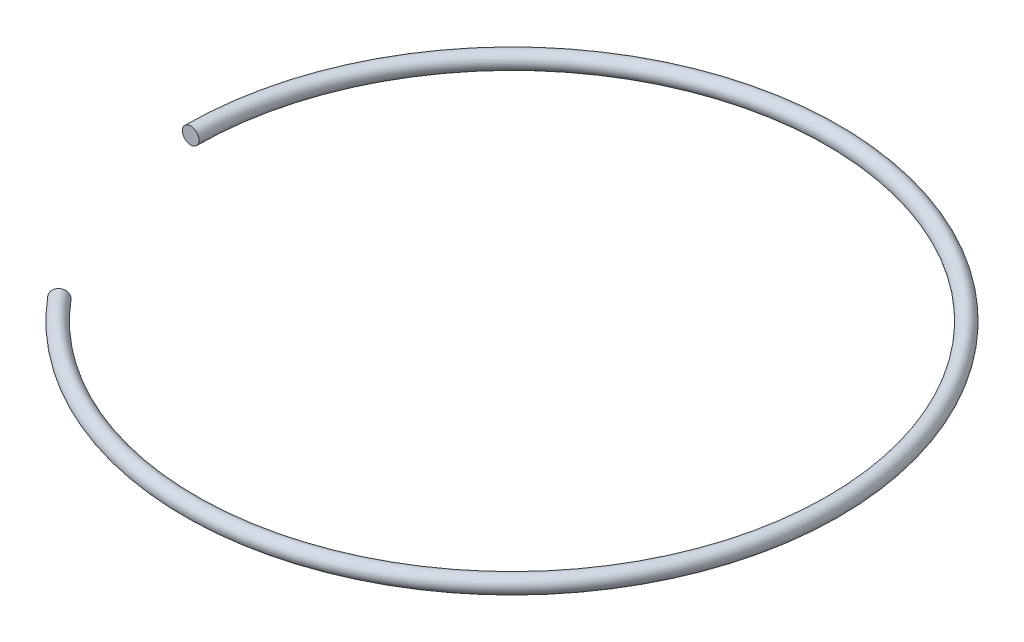
ISO-10303-21;
HEADER;
FILE_DESCRIPTION(('STEP AP214'),'2;1');
FILE_NAME('part.step','',(''),(''),'','','');
FILE_SCHEMA(('AUTOMOTIVE_DESIGN { 1 0 10303 214 1 1 1 1 }'));
ENDSEC;
DATA;
#1=APPLICATION_CONTEXT('core data for automotive mechanical design processes');
#2=APPLICATION_PROTOCOL_DEFINITION('international standard','automotive_design',2000,#1);
#3=PRODUCT_CONTEXT('',#1,'mechanical');
#4=PRODUCT('Part','Part','',(#3));
#5=PRODUCT_RELATED_PRODUCT_CATEGORY('part','',(#4));
#6=PRODUCT_DEFINITION_FORMATION('','',#4);
#7=PRODUCT_DEFINITION_CONTEXT('part definition',#1,'design');
#8=PRODUCT_DEFINITION('design','',#6,#7);
#9=PRODUCT_DEFINITION_SHAPE('','',#8);
#10=(LENGTH_UNIT() NAMED_UNIT(*) SI_UNIT(.MILLI.,.METRE.));
#11=(NAMED_UNIT(*) PLANE_ANGLE_UNIT() SI_UNIT($,.RADIAN.));
#12=(NAMED_UNIT(*) SI_UNIT($,.STERADIAN.) SOLID_ANGLE_UNIT());
#13=UNCERTAINTY_MEASURE_WITH_UNIT(LENGTH_MEASURE(1.E-05),#10,'distance_accuracy_value','');
#14=(GEOMETRIC_REPRESENTATION_CONTEXT(3) GLOBAL_UNCERTAINTY_ASSIGNED_CONTEXT((#13)) GLOBAL_UNIT_ASSIGNED_CONTEXT((#10,
#11,#12)) REPRESENTATION_CONTEXT('',''));
#15=CARTESIAN_POINT('',(0.,0.,0.));
#16=DIRECTION('',(0.,0.,1.));
#17=DIRECTION('',(1.,0.,0.));
#18=AXIS2_PLACEMENT_3D('',#15,#16,#17);
#19=CARTESIAN_POINT('',(0.,5.,0.));
#20=DIRECTION('',(0.,0.,1.));
#21=DIRECTION('',(1.,0.,0.));
#22=AXIS2_PLACEMENT_3D('',#19,#20,#21);
#23=PLANE('',#22);
#24=CARTESIAN_POINT('',(-5.65,0.440000000000001,0.));
#25=CARTESIAN_POINT('',(-5.65001062983499,0.42319249164499,0.));
#26=CARTESIAN_POINT('',(-5.65287538462174,0.406281558710686,0.));
#27=CARTESIAN_POINT('',(-5.66403597751348,0.374416764003044,0.));
#28=CARTESIAN_POINT('',(-5.67233181561848,0.359462902229706,0.));
#29=CARTESIAN_POINT('',(-5.69340700512756,0.333129254032241,0.));
#30=CARTESIAN_POINT('',(-5.70618635653177,0.321749467608205,0.));
#31=CARTESIAN_POINT('',(-5.73479109373737,0.303865334950795,0.));
#32=CARTESIAN_POINT('',(-5.75061647953878,0.297360988717422,0.));
#33=CARTESIAN_POINT('',(-5.78352818642906,0.289956461444852,0.));
#34=CARTESIAN_POINT('',(-5.80061450751794,0.289056280405655,0.));
#35=CARTESIAN_POINT('',(-5.83412206349802,0.292961554634673,0.));
#36=CARTESIAN_POINT('',(-5.85054329838922,0.297767009902889,0.));
#37=CARTESIAN_POINT('',(-5.88086889279606,0.312546438693667,0.));
#38=CARTESIAN_POINT('',(-5.89477325231169,0.322520412216229,0.));
#39=CARTESIAN_POINT('',(-5.91849883134805,0.346493762829983,0.));
#40=CARTESIAN_POINT('',(-5.92832005086878,0.360493139921175,0.));
#41=CARTESIAN_POINT('',(-5.94276711566352,0.391008812850514,0.));
#42=CARTESIAN_POINT('',(-5.94739296093752,0.40752510868866,0.));
#43=CARTESIAN_POINT('',(-5.94972637429642,0.429476017085077,0.));
#44=CARTESIAN_POINT('',(-5.95000333113523,0.434732930161899,0.));
#45=CARTESIAN_POINT('',(-5.94998937016501,0.456807508355013,0.));
#46=CARTESIAN_POINT('',(-5.94712461537826,0.473718441289317,0.));
#47=CARTESIAN_POINT('',(-5.93596402248651,0.505583235996959,0.));
#48=CARTESIAN_POINT('',(-5.92766818438152,0.520537097770296,0.));
#49=CARTESIAN_POINT('',(-5.90659299487243,0.546870745967761,0.));
#50=CARTESIAN_POINT('',(-5.89381364346823,0.558250532391797,0.));
#51=CARTESIAN_POINT('',(-5.86520890626262,0.576134665049207,0.));
#52=CARTESIAN_POINT('',(-5.84938352046122,0.58263901128258,0.));
#53=CARTESIAN_POINT('',(-5.81647181357094,0.590043538555151,0.));
#54=CARTESIAN_POINT('',(-5.79938549248206,0.590943719594348,0.));
#55=CARTESIAN_POINT('',(-5.76587793650198,0.587038445365329,0.));
#56=CARTESIAN_POINT('',(-5.74945670161078,0.582232990097113,0.));
#57=CARTESIAN_POINT('',(-5.71913110720394,0.567453561306336,0.));
#58=CARTESIAN_POINT('',(-5.70522674768831,0.557479587783773,0.));
#59=CARTESIAN_POINT('',(-5.68150116865194,0.533506237170019,0.));
#60=CARTESIAN_POINT('',(-5.67167994913122,0.519506860078827,0.));
#61=CARTESIAN_POINT('',(-5.65723288433648,0.488991187149488,0.));
#62=CARTESIAN_POINT('',(-5.65260703906247,0.472474891311342,0.));
#63=CARTESIAN_POINT('',(-5.65027362570358,0.450523982914926,0.));
#64=CARTESIAN_POINT('',(-5.64999666886477,0.445267069838103,0.));
#65=CARTESIAN_POINT('',(-5.65,0.440000000000001,0.));
#66=B_SPLINE_CURVE_WITH_KNOTS('',3,(#24,#25,#26,#27,#28,#29,#30,#31,#32,#33,#34,#35,#36,#37,#38,
#39,#40,#41,#42,#43,#44,#45,#46,#47,#48,#49,#50,#51,#52,#53,#54,#55,#56,#57,#58,#59,#60,#61,#62,
#63,#64,#65),.UNSPECIFIED.,.T.,.F.,(4,2,2,2,2,2,2,2,2,2,2,2,2,2,2,2,2,2,2,2,4),(0.,
0.0503657057955507,0.100731411591101,0.151097117387924,0.201462823184746,0.251828528981567,
0.302194234778389,0.352559940575211,0.402925646372032,0.453291352168854,0.469074755887429,
0.51944046168298,0.56980616747853,0.620171873275352,0.670537579072174,0.720903284868996,
0.771268990665817,0.82163469646264,0.872000402259462,0.922366108056283,0.938149511774858),.UNSPECIFIED.);
#67=CARTESIAN_POINT('',(-5.65,0.440000000000001,0.));
#68=VERTEX_POINT('',#67);
#69=EDGE_CURVE('E19',#68,#68,#66,.T.);
#70=ORIENTED_EDGE('',*,*,#69,.F.);
#71=EDGE_LOOP('',(#70));
#72=FACE_BOUND('',#71,.T.);
#73=ADVANCED_FACE('F15',(#72),#23,.T.);
#74=CARTESIAN_POINT('',(0.,5.,0.));
#75=DIRECTION('',(0.64278760968653,0.,0.766044443118986));
#76=DIRECTION('',(0.766044443118986,0.,-0.64278760968653));
#77=AXIS2_PLACEMENT_3D('',#74,#75,#76);
#78=PLANE('',#77);
#79=CARTESIAN_POINT('',(-4.55796443655797,0.440000000000001,3.82458627763485));
#80=CARTESIAN_POINT('',(-4.55795629363194,0.42319249164499,3.82457944490863));
#81=CARTESIAN_POINT('',(-4.55576176414665,0.406281558710685,3.82273801602692));
#82=CARTESIAN_POINT('',(-4.54721225398002,0.374416764003044,3.81556412519935));
#83=CARTESIAN_POINT('',(-4.54085727329867,0.359462902229706,3.81023166325349));
#84=CARTESIAN_POINT('',(-4.52471274148756,0.333129254032242,3.79668479256525));
#85=CARTESIAN_POINT('',(-4.5149231903577,0.321749467608205,3.7884703838228));
#86=CARTESIAN_POINT('',(-4.49301069037447,0.303865334950795,3.7700836131687));
#87=CARTESIAN_POINT('',(-4.48088774152108,0.297360988717422,3.75991125125705));
#88=CARTESIAN_POINT('',(-4.45567591134422,0.289956461444852,3.73875601385434));
#89=CARTESIAN_POINT('',(-4.44258703002075,0.289056280405655,3.72777313836328));
#90=CARTESIAN_POINT('',(-4.41691875295971,0.292961554634673,3.70623489654841));
#91=CARTESIAN_POINT('',(-4.40433935722215,0.297767009902889,3.69567953022459));
#92=CARTESIAN_POINT('',(-4.38110860414251,0.312546438693667,3.6761866138835));
#93=CARTESIAN_POINT('',(-4.37045724680043,0.322520412216229,3.66724906386622));
#94=CARTESIAN_POINT('',(-4.35228239881985,0.346493762829984,3.65199855562901));
#95=CARTESIAN_POINT('',(-4.34475890818134,0.360493139921176,3.64568559740907));
#96=CARTESIAN_POINT('',(-4.33369181447595,0.391008812850514,3.63639920316268));
#97=CARTESIAN_POINT('',(-4.33014821140907,0.40752510868866,3.63342576713622));
#98=CARTESIAN_POINT('',(-4.32836071307199,0.429476017085077,3.63192587794084));
#99=CARTESIAN_POINT('',(-4.32814855182463,0.434732930161899,3.63174785351644));
#100=CARTESIAN_POINT('',(-4.32815924654829,0.456807508355013,3.63175682745512));
#101=CARTESIAN_POINT('',(-4.33035377603358,0.473718441289317,3.63359825633683));
#102=CARTESIAN_POINT('',(-4.33890328620022,0.505583235996959,3.6407721471644));
#103=CARTESIAN_POINT('',(-4.34525826688156,0.520537097770296,3.64610460911026));
#104=CARTESIAN_POINT('',(-4.36140279869268,0.546870745967761,3.65965147979849));
#105=CARTESIAN_POINT('',(-4.37119234982253,0.558250532391798,3.66786588854094));
#106=CARTESIAN_POINT('',(-4.39310484980577,0.576134665049207,3.68625265919505));
#107=CARTESIAN_POINT('',(-4.40522779865915,0.58263901128258,3.6964250211067));
#108=CARTESIAN_POINT('',(-4.43043962883601,0.590043538555151,3.71758025850941));
#109=CARTESIAN_POINT('',(-4.44352851015949,0.590943719594348,3.72856313400046));
#110=CARTESIAN_POINT('',(-4.46919678722053,0.587038445365329,3.75010137581534));
#111=CARTESIAN_POINT('',(-4.48177618295809,0.582232990097113,3.76065674213915));
#112=CARTESIAN_POINT('',(-4.50500693603772,0.567453561306336,3.78014965848025));
#113=CARTESIAN_POINT('',(-4.5156582933798,0.557479587783773,3.78908720849753));
#114=CARTESIAN_POINT('',(-4.53383314136039,0.533506237170019,3.80433771673474));
#115=CARTESIAN_POINT('',(-4.54135663199889,0.519506860078827,3.81065067495467));
#116=CARTESIAN_POINT('',(-4.55242372570428,0.488991187149489,3.81993706920107));
#117=CARTESIAN_POINT('',(-4.55596732877116,0.472474891311342,3.82291050522753));
#118=CARTESIAN_POINT('',(-4.55775482710825,0.450523982914926,3.8244103944229));
#119=CARTESIAN_POINT('',(-4.5579669883556,0.445267069838103,3.82458841884731));
#120=CARTESIAN_POINT('',(-4.55796443655797,0.440000000000001,3.82458627763485));
#121=B_SPLINE_CURVE_WITH_KNOTS('',3,(#79,#80,#81,#82,#83,#84,#85,#86,#87,#88,#89,#90,#91,#92,
#93,#94,#95,#96,#97,#98,#99,#100,#101,#102,#103,#104,#105,#106,#107,#108,#109,#110,#111,#112,
#113,#114,#115,#116,#117,#118,#119,#120),.UNSPECIFIED.,.T.,.F.,(4,2,2,2,2,2,2,2,2,2,2,2,2,2,2,2,
2,2,2,2,4),(0.,0.0503657057955506,0.100731411591101,0.151097117387923,0.201462823184746,
0.251828528981567,0.302194234778388,0.352559940575211,0.402925646372033,0.453291352168855,
0.469074755887429,0.51944046168298,0.569806167478531,0.620171873275353,0.670537579072175,
0.720903284868997,0.771268990665818,0.821634696462639,0.872000402259461,0.922366108056283,
0.938149511774858),.UNSPECIFIED.);
#122=CARTESIAN_POINT('',(-4.55796443655797,0.440000000000001,3.82458627763485));
#123=VERTEX_POINT('',#122);
#124=EDGE_CURVE('E10',#123,#123,#121,.T.);
#125=ORIENTED_EDGE('',*,*,#124,.F.);
#126=EDGE_LOOP('',(#125));
#127=FACE_BOUND('',#126,.T.);
#128=ADVANCED_FACE('F35',(#127),#78,.F.);
#129=CARTESIAN_POINT('',(0.,0.440000000000001,0.));
#130=DIRECTION('',(0.,-1.,0.));
#131=DIRECTION('',(0.,0.,1.));
#132=AXIS2_PLACEMENT_3D('',#129,#130,#131);
#133=TOROIDAL_SURFACE('',#132,5.8,0.150000000000001);
#134=ORIENTED_EDGE('',*,*,#124,.T.);
#135=EDGE_LOOP('',(#134));
#136=FACE_BOUND('',#135,.T.);
#137=ORIENTED_EDGE('',*,*,#69,.T.);
#138=EDGE_LOOP('',(#137));
#139=FACE_BOUND('',#138,.T.);
#140=ADVANCED_FACE('F37',(#136,#139),#133,.T.);
#141=CLOSED_SHELL('',(#73,#128,#140));
#142=MANIFOLD_SOLID_BREP('B1',#141);
#143=ADVANCED_BREP_SHAPE_REPRESENTATION('',(#18,#142),#14);
#144=SHAPE_DEFINITION_REPRESENTATION(#9,#143);
ENDSEC;
END-ISO-10303-21;
